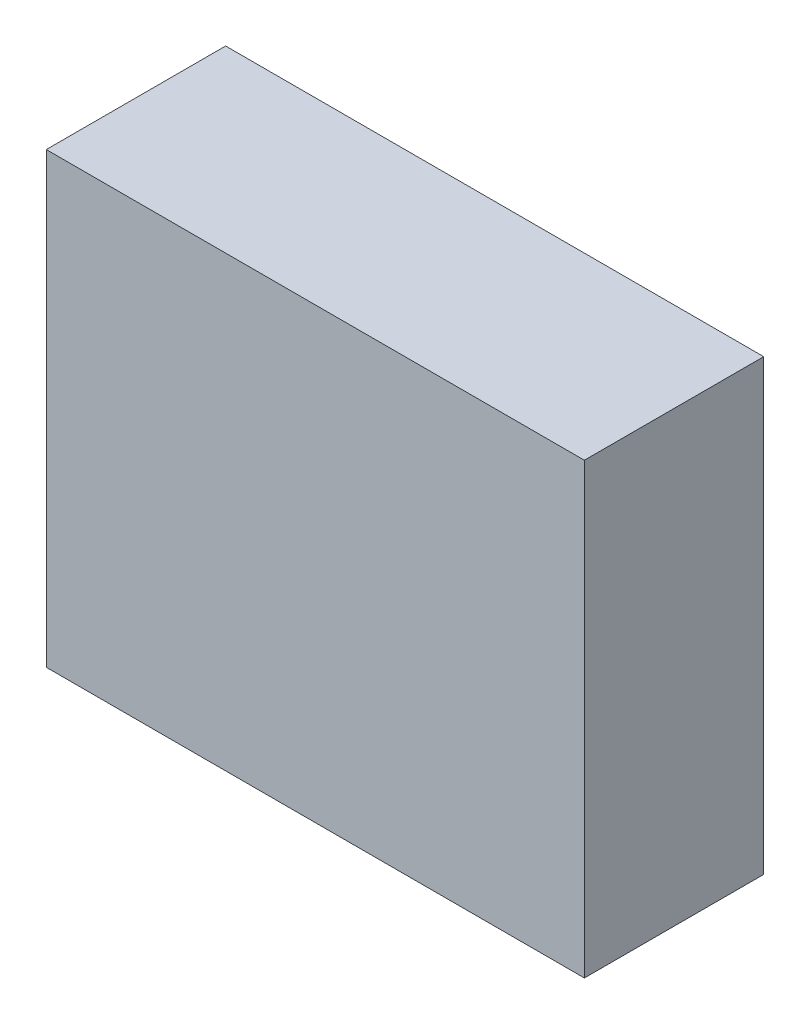
ISO-10303-21;
HEADER;
FILE_DESCRIPTION(('STEP AP214'),'2;1');
FILE_NAME('part.step','',(''),(''),'','','');
FILE_SCHEMA(('AUTOMOTIVE_DESIGN { 1 0 10303 214 1 1 1 1 }'));
ENDSEC;
DATA;
#1=APPLICATION_CONTEXT('core data for automotive mechanical design processes');
#2=APPLICATION_PROTOCOL_DEFINITION('international standard','automotive_design',2000,#1);
#3=PRODUCT_CONTEXT('',#1,'mechanical');
#4=PRODUCT('Part','Part','',(#3));
#5=PRODUCT_RELATED_PRODUCT_CATEGORY('part','',(#4));
#6=PRODUCT_DEFINITION_FORMATION('','',#4);
#7=PRODUCT_DEFINITION_CONTEXT('part definition',#1,'design');
#8=PRODUCT_DEFINITION('design','',#6,#7);
#9=PRODUCT_DEFINITION_SHAPE('','',#8);
#10=(LENGTH_UNIT() NAMED_UNIT(*) SI_UNIT(.MILLI.,.METRE.));
#11=(NAMED_UNIT(*) PLANE_ANGLE_UNIT() SI_UNIT($,.RADIAN.));
#12=(NAMED_UNIT(*) SI_UNIT($,.STERADIAN.) SOLID_ANGLE_UNIT());
#13=UNCERTAINTY_MEASURE_WITH_UNIT(LENGTH_MEASURE(1.E-05),#10,'distance_accuracy_value','');
#14=(GEOMETRIC_REPRESENTATION_CONTEXT(3) GLOBAL_UNCERTAINTY_ASSIGNED_CONTEXT((#13)) GLOBAL_UNIT_ASSIGNED_CONTEXT((#10,
#11,#12)) REPRESENTATION_CONTEXT('',''));
#15=CARTESIAN_POINT('',(0.,0.,0.));
#16=DIRECTION('',(0.,0.,1.));
#17=DIRECTION('',(1.,0.,0.));
#18=AXIS2_PLACEMENT_3D('',#15,#16,#17);
#19=CARTESIAN_POINT('',(0.,0.,10.));
#20=DIRECTION('',(1.,0.,0.));
#21=DIRECTION('',(0.,1.,0.));
#22=AXIS2_PLACEMENT_3D('',#19,#20,#21);
#23=PLANE('',#22);
#24=DIRECTION('',(0.,-1.,0.));
#25=VECTOR('',#24,1.);
#26=CARTESIAN_POINT('',(0.,0.,0.));
#27=LINE('',#26,#25);
#28=CARTESIAN_POINT('',(0.,0.,0.));
#29=VERTEX_POINT('',#28);
#30=CARTESIAN_POINT('',(0.,-25.,0.));
#31=VERTEX_POINT('',#30);
#32=EDGE_CURVE('E96',#29,#31,#27,.T.);
#33=ORIENTED_EDGE('',*,*,#32,.T.);
#34=DIRECTION('',(0.,0.,-1.));
#35=VECTOR('',#34,1.);
#36=CARTESIAN_POINT('',(0.,-25.,10.));
#37=LINE('',#36,#35);
#38=CARTESIAN_POINT('',(0.,-25.,10.));
#39=VERTEX_POINT('',#38);
#40=EDGE_CURVE('E11',#39,#31,#37,.T.);
#41=ORIENTED_EDGE('',*,*,#40,.F.);
#42=DIRECTION('',(0.,-1.,0.));
#43=VECTOR('',#42,1.);
#44=CARTESIAN_POINT('',(0.,0.,10.));
#45=LINE('',#44,#43);
#46=CARTESIAN_POINT('',(0.,0.,10.));
#47=VERTEX_POINT('',#46);
#48=EDGE_CURVE('E84',#47,#39,#45,.T.);
#49=ORIENTED_EDGE('',*,*,#48,.F.);
#50=DIRECTION('',(0.,0.,-1.));
#51=VECTOR('',#50,1.);
#52=CARTESIAN_POINT('',(0.,0.,10.));
#53=LINE('',#52,#51);
#54=EDGE_CURVE('E92',#47,#29,#53,.T.);
#55=ORIENTED_EDGE('',*,*,#54,.T.);
#56=EDGE_LOOP('',(#33,#41,#49,#55));
#57=FACE_BOUND('',#56,.T.);
#58=ADVANCED_FACE('F33',(#57),#23,.F.);
#59=CARTESIAN_POINT('',(0.,-25.,10.));
#60=DIRECTION('',(0.,1.,0.));
#61=DIRECTION('',(0.,0.,1.));
#62=AXIS2_PLACEMENT_3D('',#59,#60,#61);
#63=PLANE('',#62);
#64=DIRECTION('',(1.,0.,0.));
#65=VECTOR('',#64,1.);
#66=CARTESIAN_POINT('',(0.,-25.,0.));
#67=LINE('',#66,#65);
#68=CARTESIAN_POINT('',(30.,-25.,0.));
#69=VERTEX_POINT('',#68);
#70=EDGE_CURVE('E88',#31,#69,#67,.T.);
#71=ORIENTED_EDGE('',*,*,#70,.T.);
#72=DIRECTION('',(0.,0.,-1.));
#73=VECTOR('',#72,1.);
#74=CARTESIAN_POINT('',(30.,-25.,10.));
#75=LINE('',#74,#73);
#76=CARTESIAN_POINT('',(30.,-25.,10.));
#77=VERTEX_POINT('',#76);
#78=EDGE_CURVE('E41',#77,#69,#75,.T.);
#79=ORIENTED_EDGE('',*,*,#78,.F.);
#80=DIRECTION('',(1.,0.,0.));
#81=VECTOR('',#80,1.);
#82=CARTESIAN_POINT('',(0.,-25.,10.));
#83=LINE('',#82,#81);
#84=EDGE_CURVE('E79',#39,#77,#83,.T.);
#85=ORIENTED_EDGE('',*,*,#84,.F.);
#86=ORIENTED_EDGE('',*,*,#40,.T.);
#87=EDGE_LOOP('',(#71,#79,#85,#86));
#88=FACE_BOUND('',#87,.T.);
#89=ADVANCED_FACE('F87',(#88),#63,.F.);
#90=CARTESIAN_POINT('',(30.,0.,10.));
#91=DIRECTION('',(-1.,0.,0.));
#92=DIRECTION('',(0.,-1.,0.));
#93=AXIS2_PLACEMENT_3D('',#90,#91,#92);
#94=PLANE('',#93);
#95=DIRECTION('',(0.,1.,0.));
#96=VECTOR('',#95,1.);
#97=CARTESIAN_POINT('',(30.,0.,0.));
#98=LINE('',#97,#96);
#99=CARTESIAN_POINT('',(30.,0.,0.));
#100=VERTEX_POINT('',#99);
#101=EDGE_CURVE('E66',#69,#100,#98,.T.);
#102=ORIENTED_EDGE('',*,*,#101,.T.);
#103=DIRECTION('',(0.,0.,-1.));
#104=VECTOR('',#103,1.);
#105=CARTESIAN_POINT('',(30.,0.,10.));
#106=LINE('',#105,#104);
#107=CARTESIAN_POINT('',(30.,0.,10.));
#108=VERTEX_POINT('',#107);
#109=EDGE_CURVE('E89',#108,#100,#106,.T.);
#110=ORIENTED_EDGE('',*,*,#109,.F.);
#111=DIRECTION('',(0.,1.,0.));
#112=VECTOR('',#111,1.);
#113=CARTESIAN_POINT('',(30.,0.,10.));
#114=LINE('',#113,#112);
#115=EDGE_CURVE('E82',#77,#108,#114,.T.);
#116=ORIENTED_EDGE('',*,*,#115,.F.);
#117=ORIENTED_EDGE('',*,*,#78,.T.);
#118=EDGE_LOOP('',(#102,#110,#116,#117));
#119=FACE_BOUND('',#118,.T.);
#120=ADVANCED_FACE('F90',(#119),#94,.F.);
#121=CARTESIAN_POINT('',(0.,0.,10.));
#122=DIRECTION('',(0.,-1.,0.));
#123=DIRECTION('',(0.,0.,-1.));
#124=AXIS2_PLACEMENT_3D('',#121,#122,#123);
#125=PLANE('',#124);
#126=DIRECTION('',(-1.,0.,0.));
#127=VECTOR('',#126,1.);
#128=CARTESIAN_POINT('',(0.,0.,0.));
#129=LINE('',#128,#127);
#130=EDGE_CURVE('E72',#100,#29,#129,.T.);
#131=ORIENTED_EDGE('',*,*,#130,.T.);
#132=ORIENTED_EDGE('',*,*,#54,.F.);
#133=DIRECTION('',(-1.,0.,0.));
#134=VECTOR('',#133,1.);
#135=CARTESIAN_POINT('',(0.,0.,10.));
#136=LINE('',#135,#134);
#137=EDGE_CURVE('E49',#108,#47,#136,.T.);
#138=ORIENTED_EDGE('',*,*,#137,.F.);
#139=ORIENTED_EDGE('',*,*,#109,.T.);
#140=EDGE_LOOP('',(#131,#132,#138,#139));
#141=FACE_BOUND('',#140,.T.);
#142=ADVANCED_FACE('F103',(#141),#125,.F.);
#143=CARTESIAN_POINT('',(0.,0.,10.));
#144=DIRECTION('',(0.,0.,1.));
#145=DIRECTION('',(1.,0.,0.));
#146=AXIS2_PLACEMENT_3D('',#143,#144,#145);
#147=PLANE('',#146);
#148=ORIENTED_EDGE('',*,*,#48,.T.);
#149=ORIENTED_EDGE('',*,*,#84,.T.);
#150=ORIENTED_EDGE('',*,*,#115,.T.);
#151=ORIENTED_EDGE('',*,*,#137,.T.);
#152=EDGE_LOOP('',(#148,#149,#150,#151));
#153=FACE_BOUND('',#152,.T.);
#154=ADVANCED_FACE('F80',(#153),#147,.T.);
#155=CARTESIAN_POINT('',(0.,0.,0.));
#156=DIRECTION('',(0.,0.,1.));
#157=DIRECTION('',(1.,0.,0.));
#158=AXIS2_PLACEMENT_3D('',#155,#156,#157);
#159=PLANE('',#158);
#160=ORIENTED_EDGE('',*,*,#32,.F.);
#161=ORIENTED_EDGE('',*,*,#130,.F.);
#162=ORIENTED_EDGE('',*,*,#101,.F.);
#163=ORIENTED_EDGE('',*,*,#70,.F.);
#164=EDGE_LOOP('',(#160,#161,#162,#163));
#165=FACE_BOUND('',#164,.T.);
#166=ADVANCED_FACE('F106',(#165),#159,.F.);
#167=CLOSED_SHELL('',(#58,#89,#120,#142,#154,#166));
#168=MANIFOLD_SOLID_BREP('B2',#167);
#169=ADVANCED_BREP_SHAPE_REPRESENTATION('',(#18,#168),#14);
#170=SHAPE_DEFINITION_REPRESENTATION(#9,#169);
ENDSEC;
END-ISO-10303-21;
